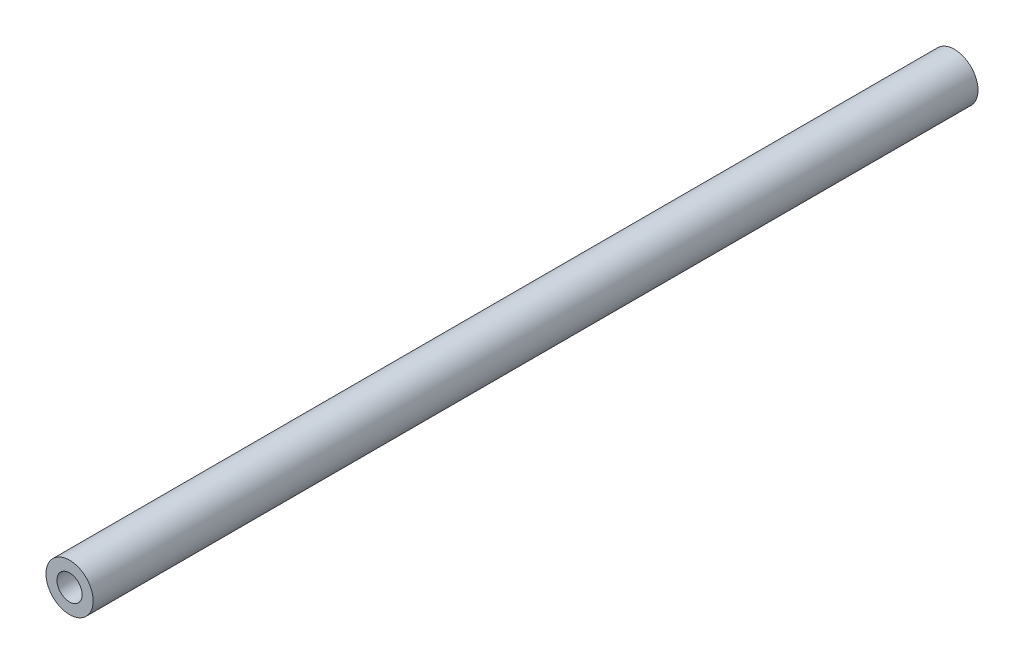
ISO-10303-21;
HEADER;
FILE_DESCRIPTION(('STEP AP214'),'2;1');
FILE_NAME('part.step','',(''),(''),'','','');
FILE_SCHEMA(('AUTOMOTIVE_DESIGN { 1 0 10303 214 1 1 1 1 }'));
ENDSEC;
DATA;
#1=APPLICATION_CONTEXT('core data for automotive mechanical design processes');
#2=APPLICATION_PROTOCOL_DEFINITION('international standard','automotive_design',2000,#1);
#3=PRODUCT_CONTEXT('',#1,'mechanical');
#4=PRODUCT('Part','Part','',(#3));
#5=PRODUCT_RELATED_PRODUCT_CATEGORY('part','',(#4));
#6=PRODUCT_DEFINITION_FORMATION('','',#4);
#7=PRODUCT_DEFINITION_CONTEXT('part definition',#1,'design');
#8=PRODUCT_DEFINITION('design','',#6,#7);
#9=PRODUCT_DEFINITION_SHAPE('','',#8);
#10=(LENGTH_UNIT() NAMED_UNIT(*) SI_UNIT(.MILLI.,.METRE.));
#11=(NAMED_UNIT(*) PLANE_ANGLE_UNIT() SI_UNIT($,.RADIAN.));
#12=(NAMED_UNIT(*) SI_UNIT($,.STERADIAN.) SOLID_ANGLE_UNIT());
#13=UNCERTAINTY_MEASURE_WITH_UNIT(LENGTH_MEASURE(1.E-05),#10,'distance_accuracy_value','');
#14=(GEOMETRIC_REPRESENTATION_CONTEXT(3) GLOBAL_UNCERTAINTY_ASSIGNED_CONTEXT((#13)) GLOBAL_UNIT_ASSIGNED_CONTEXT((#10,
#11,#12)) REPRESENTATION_CONTEXT('',''));
#15=CARTESIAN_POINT('',(0.,0.,0.));
#16=DIRECTION('',(0.,0.,1.));
#17=DIRECTION('',(1.,0.,0.));
#18=AXIS2_PLACEMENT_3D('',#15,#16,#17);
#19=CARTESIAN_POINT('',(0.,0.,112.5));
#20=DIRECTION('',(0.,0.,-1.));
#21=DIRECTION('',(-1.,0.,0.));
#22=AXIS2_PLACEMENT_3D('',#19,#20,#21);
#23=CYLINDRICAL_SURFACE('',#22,6.);
#24=CARTESIAN_POINT('',(0.,0.,112.5));
#25=DIRECTION('',(0.,0.,1.));
#26=DIRECTION('',(1.,0.,0.));
#27=AXIS2_PLACEMENT_3D('',#24,#25,#26);
#28=CIRCLE('',#27,6.);
#29=CARTESIAN_POINT('',(6.,0.,112.5));
#30=VERTEX_POINT('',#29);
#31=EDGE_CURVE('E11',#30,#30,#28,.T.);
#32=ORIENTED_EDGE('',*,*,#31,.F.);
#33=EDGE_LOOP('',(#32));
#34=FACE_BOUND('',#33,.T.);
#35=CARTESIAN_POINT('',(0.,0.,-112.5));
#36=DIRECTION('',(0.,0.,1.));
#37=DIRECTION('',(1.,0.,0.));
#38=AXIS2_PLACEMENT_3D('',#35,#36,#37);
#39=CIRCLE('',#38,6.);
#40=CARTESIAN_POINT('',(6.,0.,-112.5));
#41=VERTEX_POINT('',#40);
#42=EDGE_CURVE('E42',#41,#41,#39,.T.);
#43=ORIENTED_EDGE('',*,*,#42,.T.);
#44=EDGE_LOOP('',(#43));
#45=FACE_BOUND('',#44,.T.);
#46=ADVANCED_FACE('F39',(#34,#45),#23,.T.);
#47=CARTESIAN_POINT('',(0.,0.,112.5));
#48=DIRECTION('',(0.,0.,1.));
#49=DIRECTION('',(1.,0.,0.));
#50=AXIS2_PLACEMENT_3D('',#47,#48,#49);
#51=PLANE('',#50);
#52=CARTESIAN_POINT('',(0.,0.,112.5));
#53=DIRECTION('',(0.,0.,1.));
#54=DIRECTION('',(1.,0.,0.));
#55=AXIS2_PLACEMENT_3D('',#52,#53,#54);
#56=CIRCLE('',#55,3.2);
#57=CARTESIAN_POINT('',(3.2,0.,112.5));
#58=VERTEX_POINT('',#57);
#59=EDGE_CURVE('E64',#58,#58,#56,.T.);
#60=ORIENTED_EDGE('',*,*,#59,.F.);
#61=EDGE_LOOP('',(#60));
#62=FACE_BOUND('',#61,.T.);
#63=ORIENTED_EDGE('',*,*,#31,.T.);
#64=EDGE_LOOP('',(#63));
#65=FACE_BOUND('',#64,.T.);
#66=ADVANCED_FACE('F87',(#62,#65),#51,.T.);
#67=CARTESIAN_POINT('',(0.,0.,-112.5));
#68=DIRECTION('',(0.,0.,1.));
#69=DIRECTION('',(1.,0.,0.));
#70=AXIS2_PLACEMENT_3D('',#67,#68,#69);
#71=PLANE('',#70);
#72=CARTESIAN_POINT('',(0.,0.,-112.5));
#73=DIRECTION('',(0.,0.,-1.));
#74=DIRECTION('',(-1.,0.,0.));
#75=AXIS2_PLACEMENT_3D('',#72,#73,#74);
#76=CIRCLE('',#75,3.2);
#77=CARTESIAN_POINT('',(-3.2,0.,-112.5));
#78=VERTEX_POINT('',#77);
#79=EDGE_CURVE('E65',#78,#78,#76,.T.);
#80=ORIENTED_EDGE('',*,*,#79,.F.);
#81=EDGE_LOOP('',(#80));
#82=FACE_BOUND('',#81,.T.);
#83=ORIENTED_EDGE('',*,*,#42,.F.);
#84=EDGE_LOOP('',(#83));
#85=FACE_BOUND('',#84,.T.);
#86=ADVANCED_FACE('F84',(#82,#85),#71,.F.);
#87=CARTESIAN_POINT('',(0.,0.,89.4227539808882));
#88=DIRECTION('',(0.,0.,1.));
#89=DIRECTION('',(1.,0.,0.));
#90=AXIS2_PLACEMENT_3D('',#87,#88,#89);
#91=CONICAL_SURFACE('',#90,3.19999999999999,1.02974425867665);
#92=CARTESIAN_POINT('',(0.,0.,87.5));
#93=VERTEX_POINT('',#92);
#94=VERTEX_LOOP('',#93);
#95=FACE_BOUND('',#94,.T.);
#96=CARTESIAN_POINT('',(0.,0.,89.4227539808882));
#97=DIRECTION('',(0.,0.,1.));
#98=DIRECTION('',(1.,0.,0.));
#99=AXIS2_PLACEMENT_3D('',#96,#97,#98);
#100=CIRCLE('',#99,3.19999999999999);
#101=CARTESIAN_POINT('',(3.19999999999999,0.,89.4227539808882));
#102=VERTEX_POINT('',#101);
#103=EDGE_CURVE('E70',#102,#102,#100,.T.);
#104=ORIENTED_EDGE('',*,*,#103,.T.);
#105=EDGE_LOOP('',(#104));
#106=FACE_BOUND('',#105,.T.);
#107=ADVANCED_FACE('F86',(#95,#106),#91,.F.);
#108=CARTESIAN_POINT('',(0.,0.,112.5));
#109=DIRECTION('',(0.,0.,1.));
#110=DIRECTION('',(1.,0.,0.));
#111=AXIS2_PLACEMENT_3D('',#108,#109,#110);
#112=CYLINDRICAL_SURFACE('',#111,3.2);
#113=ORIENTED_EDGE('',*,*,#103,.F.);
#114=EDGE_LOOP('',(#113));
#115=FACE_BOUND('',#114,.T.);
#116=ORIENTED_EDGE('',*,*,#59,.T.);
#117=EDGE_LOOP('',(#116));
#118=FACE_BOUND('',#117,.T.);
#119=ADVANCED_FACE('F57',(#115,#118),#112,.F.);
#120=CARTESIAN_POINT('',(0.,0.,-89.4227539808882));
#121=DIRECTION('',(0.,0.,-1.));
#122=DIRECTION('',(-1.,0.,0.));
#123=AXIS2_PLACEMENT_3D('',#120,#121,#122);
#124=CONICAL_SURFACE('',#123,3.19999999999999,1.02974425867665);
#125=CARTESIAN_POINT('',(0.,0.,-87.5));
#126=VERTEX_POINT('',#125);
#127=VERTEX_LOOP('',#126);
#128=FACE_BOUND('',#127,.T.);
#129=CARTESIAN_POINT('',(0.,0.,-89.4227539808882));
#130=DIRECTION('',(0.,0.,-1.));
#131=DIRECTION('',(-1.,0.,0.));
#132=AXIS2_PLACEMENT_3D('',#129,#130,#131);
#133=CIRCLE('',#132,3.19999999999999);
#134=CARTESIAN_POINT('',(-3.19999999999999,0.,-89.4227539808882));
#135=VERTEX_POINT('',#134);
#136=EDGE_CURVE('E61',#135,#135,#133,.T.);
#137=ORIENTED_EDGE('',*,*,#136,.T.);
#138=EDGE_LOOP('',(#137));
#139=FACE_BOUND('',#138,.T.);
#140=ADVANCED_FACE('F53',(#128,#139),#124,.F.);
#141=CARTESIAN_POINT('',(0.,0.,-112.5));
#142=DIRECTION('',(0.,0.,-1.));
#143=DIRECTION('',(-1.,0.,0.));
#144=AXIS2_PLACEMENT_3D('',#141,#142,#143);
#145=CYLINDRICAL_SURFACE('',#144,3.2);
#146=ORIENTED_EDGE('',*,*,#136,.F.);
#147=EDGE_LOOP('',(#146));
#148=FACE_BOUND('',#147,.T.);
#149=ORIENTED_EDGE('',*,*,#79,.T.);
#150=EDGE_LOOP('',(#149));
#151=FACE_BOUND('',#150,.T.);
#152=ADVANCED_FACE('F56',(#148,#151),#145,.F.);
#153=CLOSED_SHELL('',(#46,#66,#86,#107,#119,#140,#152));
#154=MANIFOLD_SOLID_BREP('B2',#153);
#155=ADVANCED_BREP_SHAPE_REPRESENTATION('',(#18,#154),#14);
#156=SHAPE_DEFINITION_REPRESENTATION(#9,#155);
ENDSEC;
END-ISO-10303-21;
